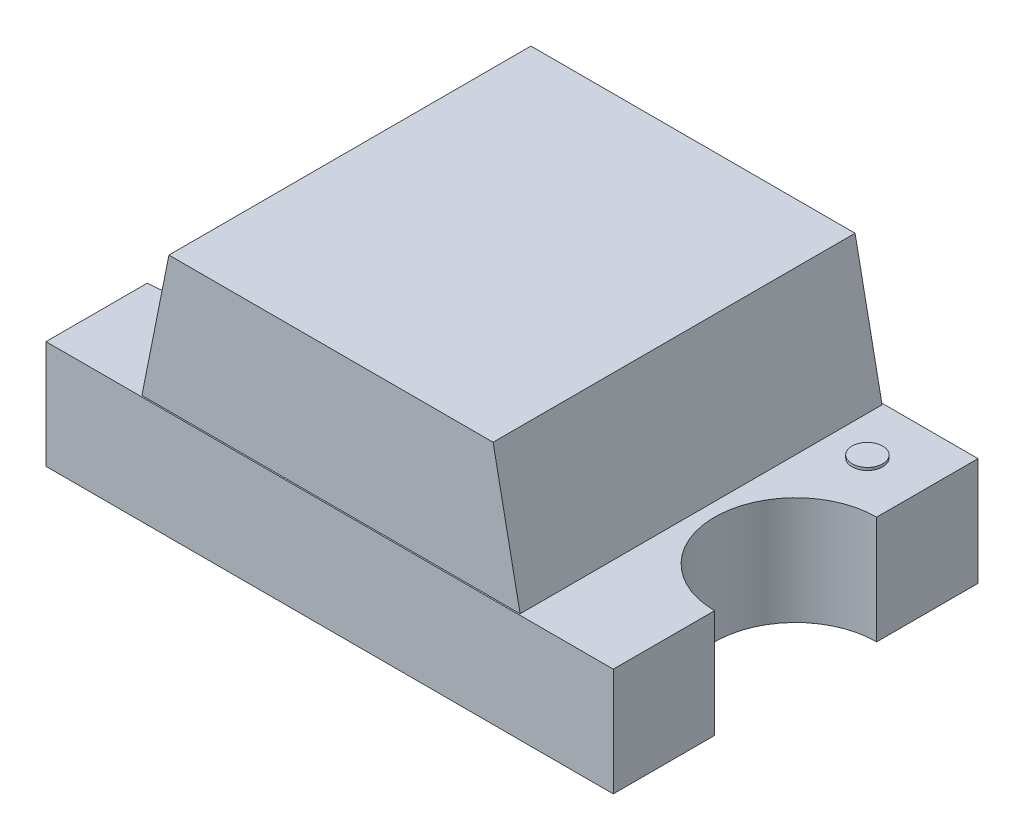
ISO-10303-21;
HEADER;
FILE_DESCRIPTION(('STEP AP214'),'2;1');
FILE_NAME('part.step','',(''),(''),'','','');
FILE_SCHEMA(('AUTOMOTIVE_DESIGN { 1 0 10303 214 1 1 1 1 }'));
ENDSEC;
DATA;
#1=APPLICATION_CONTEXT('core data for automotive mechanical design processes');
#2=APPLICATION_PROTOCOL_DEFINITION('international standard','automotive_design',2000,#1);
#3=PRODUCT_CONTEXT('',#1,'mechanical');
#4=PRODUCT('Part','Part','',(#3));
#5=PRODUCT_RELATED_PRODUCT_CATEGORY('part','',(#4));
#6=PRODUCT_DEFINITION_FORMATION('','',#4);
#7=PRODUCT_DEFINITION_CONTEXT('part definition',#1,'design');
#8=PRODUCT_DEFINITION('design','',#6,#7);
#9=PRODUCT_DEFINITION_SHAPE('','',#8);
#10=(LENGTH_UNIT() NAMED_UNIT(*) SI_UNIT(.MILLI.,.METRE.));
#11=(NAMED_UNIT(*) PLANE_ANGLE_UNIT() SI_UNIT($,.RADIAN.));
#12=(NAMED_UNIT(*) SI_UNIT($,.STERADIAN.) SOLID_ANGLE_UNIT());
#13=UNCERTAINTY_MEASURE_WITH_UNIT(LENGTH_MEASURE(1.E-05),#10,'distance_accuracy_value','');
#14=(GEOMETRIC_REPRESENTATION_CONTEXT(3) GLOBAL_UNCERTAINTY_ASSIGNED_CONTEXT((#13)) GLOBAL_UNIT_ASSIGNED_CONTEXT((#10,
#11,#12)) REPRESENTATION_CONTEXT('',''));
#15=CARTESIAN_POINT('',(0.,0.,0.));
#16=DIRECTION('',(0.,0.,1.));
#17=DIRECTION('',(1.,0.,0.));
#18=AXIS2_PLACEMENT_3D('',#15,#16,#17);
#19=CARTESIAN_POINT('',(-0.7,0.9,-0.67));
#20=DIRECTION('',(0.,0.,1.));
#21=DIRECTION('',(1.,0.,0.));
#22=AXIS2_PLACEMENT_3D('',#19,#20,#21);
#23=PLANE('',#22);
#24=DIRECTION('',(-1.,0.,0.));
#25=VECTOR('',#24,1.);
#26=CARTESIAN_POINT('',(-0.7,0.9,-0.67));
#27=LINE('',#26,#25);
#28=CARTESIAN_POINT('',(0.6,0.9,-0.67));
#29=VERTEX_POINT('',#28);
#30=CARTESIAN_POINT('',(-0.6,0.9,-0.67));
#31=VERTEX_POINT('',#30);
#32=EDGE_CURVE('E87',#29,#31,#27,.T.);
#33=ORIENTED_EDGE('',*,*,#32,.F.);
#34=DIRECTION('',(-0.196116135138181,0.980580675690921,0.));
#35=VECTOR('',#34,1.);
#36=CARTESIAN_POINT('',(0.6,0.9,-0.67));
#37=LINE('',#36,#35);
#38=CARTESIAN_POINT('',(0.7,0.4,-0.67));
#39=VERTEX_POINT('',#38);
#40=EDGE_CURVE('E82',#29,#39,#37,.F.);
#41=ORIENTED_EDGE('',*,*,#40,.T.);
#42=DIRECTION('',(-1.,0.,0.));
#43=VECTOR('',#42,1.);
#44=CARTESIAN_POINT('',(-0.7,0.4,-0.67));
#45=LINE('',#44,#43);
#46=CARTESIAN_POINT('',(-0.7,0.4,-0.67));
#47=VERTEX_POINT('',#46);
#48=EDGE_CURVE('E84',#39,#47,#45,.T.);
#49=ORIENTED_EDGE('',*,*,#48,.T.);
#50=DIRECTION('',(-0.196116135138181,-0.980580675690921,0.));
#51=VECTOR('',#50,1.);
#52=CARTESIAN_POINT('',(-0.6,0.9,-0.67));
#53=LINE('',#52,#51);
#54=EDGE_CURVE('E92',#47,#31,#53,.F.);
#55=ORIENTED_EDGE('',*,*,#54,.T.);
#56=EDGE_LOOP('',(#33,#41,#49,#55));
#57=FACE_BOUND('',#56,.T.);
#58=ADVANCED_FACE('F43',(#57),#23,.F.);
#59=CARTESIAN_POINT('',(-0.7,0.9,0.67));
#60=DIRECTION('',(0.,0.,-1.));
#61=DIRECTION('',(-1.,0.,0.));
#62=AXIS2_PLACEMENT_3D('',#59,#60,#61);
#63=PLANE('',#62);
#64=DIRECTION('',(1.,0.,0.));
#65=VECTOR('',#64,1.);
#66=CARTESIAN_POINT('',(-0.7,0.4,0.67));
#67=LINE('',#66,#65);
#68=CARTESIAN_POINT('',(-0.7,0.4,0.67));
#69=VERTEX_POINT('',#68);
#70=CARTESIAN_POINT('',(0.7,0.4,0.67));
#71=VERTEX_POINT('',#70);
#72=EDGE_CURVE('E109',#69,#71,#67,.T.);
#73=ORIENTED_EDGE('',*,*,#72,.T.);
#74=DIRECTION('',(0.196116135138181,-0.980580675690921,0.));
#75=VECTOR('',#74,1.);
#76=CARTESIAN_POINT('',(0.6,0.9,0.67));
#77=LINE('',#76,#75);
#78=CARTESIAN_POINT('',(0.6,0.9,0.67));
#79=VERTEX_POINT('',#78);
#80=EDGE_CURVE('E12',#71,#79,#77,.F.);
#81=ORIENTED_EDGE('',*,*,#80,.T.);
#82=DIRECTION('',(1.,0.,0.));
#83=VECTOR('',#82,1.);
#84=CARTESIAN_POINT('',(-0.7,0.9,0.67));
#85=LINE('',#84,#83);
#86=CARTESIAN_POINT('',(-0.6,0.9,0.67));
#87=VERTEX_POINT('',#86);
#88=EDGE_CURVE('E105',#87,#79,#85,.T.);
#89=ORIENTED_EDGE('',*,*,#88,.F.);
#90=DIRECTION('',(0.196116135138181,0.980580675690921,0.));
#91=VECTOR('',#90,1.);
#92=CARTESIAN_POINT('',(-0.6,0.9,0.67));
#93=LINE('',#92,#91);
#94=EDGE_CURVE('E51',#87,#69,#93,.F.);
#95=ORIENTED_EDGE('',*,*,#94,.T.);
#96=EDGE_LOOP('',(#73,#81,#89,#95));
#97=FACE_BOUND('',#96,.T.);
#98=ADVANCED_FACE('F115',(#97),#63,.F.);
#99=CARTESIAN_POINT('',(0.,0.9,0.));
#100=DIRECTION('',(0.,-1.,0.));
#101=DIRECTION('',(0.,0.,-1.));
#102=AXIS2_PLACEMENT_3D('',#99,#100,#101);
#103=PLANE('',#102);
#104=ORIENTED_EDGE('',*,*,#88,.T.);
#105=DIRECTION('',(0.,0.,-1.));
#106=VECTOR('',#105,1.);
#107=CARTESIAN_POINT('',(0.6,0.9,0.));
#108=LINE('',#107,#106);
#109=EDGE_CURVE('E113',#79,#29,#108,.T.);
#110=ORIENTED_EDGE('',*,*,#109,.T.);
#111=ORIENTED_EDGE('',*,*,#32,.T.);
#112=DIRECTION('',(0.,0.,1.));
#113=VECTOR('',#112,1.);
#114=CARTESIAN_POINT('',(-0.6,0.9,0.));
#115=LINE('',#114,#113);
#116=EDGE_CURVE('E111',#31,#87,#115,.T.);
#117=ORIENTED_EDGE('',*,*,#116,.T.);
#118=EDGE_LOOP('',(#104,#110,#111,#117));
#119=FACE_BOUND('',#118,.T.);
#120=ADVANCED_FACE('F117',(#119),#103,.F.);
#121=CARTESIAN_POINT('',(0.,0.4,0.));
#122=DIRECTION('',(0.,-1.,0.));
#123=DIRECTION('',(0.,0.,-1.));
#124=AXIS2_PLACEMENT_3D('',#121,#122,#123);
#125=PLANE('',#124);
#126=DIRECTION('',(0.,0.,-1.));
#127=VECTOR('',#126,1.);
#128=CARTESIAN_POINT('',(0.7,0.4,0.67));
#129=LINE('',#128,#127);
#130=EDGE_CURVE('E98',#71,#39,#129,.T.);
#131=ORIENTED_EDGE('',*,*,#130,.F.);
#132=ORIENTED_EDGE('',*,*,#72,.F.);
#133=DIRECTION('',(0.,0.,1.));
#134=VECTOR('',#133,1.);
#135=CARTESIAN_POINT('',(-0.7,0.4,0.67));
#136=LINE('',#135,#134);
#137=EDGE_CURVE('E99',#47,#69,#136,.T.);
#138=ORIENTED_EDGE('',*,*,#137,.F.);
#139=ORIENTED_EDGE('',*,*,#48,.F.);
#140=EDGE_LOOP('',(#131,#132,#138,#139));
#141=FACE_BOUND('',#140,.T.);
#142=ADVANCED_FACE('F96',(#141),#125,.T.);
#143=CARTESIAN_POINT('',(0.6,0.9,0.));
#144=DIRECTION('',(-0.980580675690921,-0.196116135138181,0.));
#145=DIRECTION('',(0.,0.,-1.));
#146=AXIS2_PLACEMENT_3D('',#143,#144,#145);
#147=PLANE('',#146);
#148=ORIENTED_EDGE('',*,*,#80,.F.);
#149=ORIENTED_EDGE('',*,*,#130,.T.);
#150=ORIENTED_EDGE('',*,*,#40,.F.);
#151=ORIENTED_EDGE('',*,*,#109,.F.);
#152=EDGE_LOOP('',(#148,#149,#150,#151));
#153=FACE_BOUND('',#152,.T.);
#154=ADVANCED_FACE('F102',(#153),#147,.F.);
#155=CARTESIAN_POINT('',(-0.6,0.9,0.));
#156=DIRECTION('',(0.980580675690921,-0.196116135138181,0.));
#157=DIRECTION('',(0.,0.,1.));
#158=AXIS2_PLACEMENT_3D('',#155,#156,#157);
#159=PLANE('',#158);
#160=ORIENTED_EDGE('',*,*,#54,.F.);
#161=ORIENTED_EDGE('',*,*,#137,.T.);
#162=ORIENTED_EDGE('',*,*,#94,.F.);
#163=ORIENTED_EDGE('',*,*,#116,.F.);
#164=EDGE_LOOP('',(#160,#161,#162,#163));
#165=FACE_BOUND('',#164,.T.);
#166=ADVANCED_FACE('F45',(#165),#159,.F.);
#167=CLOSED_SHELL('',(#58,#98,#120,#142,#154,#166));
#168=MANIFOLD_SOLID_BREP('B2',#167);
#169=CARTESIAN_POINT('',(-1.05,0.4,0.));
#170=DIRECTION('',(0.,-1.,0.));
#171=DIRECTION('',(0.,0.,-1.));
#172=AXIS2_PLACEMENT_3D('',#169,#170,#171);
#173=PLANE('',#172);
#174=DIRECTION('',(0.,0.,-1.));
#175=VECTOR('',#174,1.);
#176=CARTESIAN_POINT('',(1.05,0.4,-0.3));
#177=LINE('',#176,#175);
#178=CARTESIAN_POINT('',(1.05,0.4,-0.3));
#179=VERTEX_POINT('',#178);
#180=CARTESIAN_POINT('',(1.05,0.4,-0.675));
#181=VERTEX_POINT('',#180);
#182=EDGE_CURVE('E280',#179,#181,#177,.T.);
#183=ORIENTED_EDGE('',*,*,#182,.T.);
#184=DIRECTION('',(-1.,0.,0.));
#185=VECTOR('',#184,1.);
#186=CARTESIAN_POINT('',(-1.05,0.4,-0.675));
#187=LINE('',#186,#185);
#188=CARTESIAN_POINT('',(-1.05,0.4,-0.675));
#189=VERTEX_POINT('',#188);
#190=EDGE_CURVE('E228',#181,#189,#187,.T.);
#191=ORIENTED_EDGE('',*,*,#190,.T.);
#192=DIRECTION('',(0.,0.,1.));
#193=VECTOR('',#192,1.);
#194=CARTESIAN_POINT('',(-1.05,0.4,-0.3));
#195=LINE('',#194,#193);
#196=CARTESIAN_POINT('',(-1.05,0.4,-0.3));
#197=VERTEX_POINT('',#196);
#198=EDGE_CURVE('E311',#189,#197,#195,.T.);
#199=ORIENTED_EDGE('',*,*,#198,.T.);
#200=CARTESIAN_POINT('',(-1.05,0.4,0.));
#201=DIRECTION('',(0.,-1.,0.));
#202=DIRECTION('',(0.,0.,-1.));
#203=AXIS2_PLACEMENT_3D('',#200,#201,#202);
#204=CIRCLE('',#203,0.3);
#205=CARTESIAN_POINT('',(-1.05,0.4,0.3));
#206=VERTEX_POINT('',#205);
#207=EDGE_CURVE('E310',#197,#206,#204,.T.);
#208=ORIENTED_EDGE('',*,*,#207,.T.);
#209=DIRECTION('',(0.,0.,1.));
#210=VECTOR('',#209,1.);
#211=CARTESIAN_POINT('',(-1.05,0.4,0.675));
#212=LINE('',#211,#210);
#213=CARTESIAN_POINT('',(-1.05,0.4,0.675));
#214=VERTEX_POINT('',#213);
#215=EDGE_CURVE('E247',#206,#214,#212,.T.);
#216=ORIENTED_EDGE('',*,*,#215,.T.);
#217=DIRECTION('',(1.,0.,0.));
#218=VECTOR('',#217,1.);
#219=CARTESIAN_POINT('',(-1.05,0.4,0.675));
#220=LINE('',#219,#218);
#221=CARTESIAN_POINT('',(1.05,0.4,0.675));
#222=VERTEX_POINT('',#221);
#223=EDGE_CURVE('E241',#214,#222,#220,.T.);
#224=ORIENTED_EDGE('',*,*,#223,.T.);
#225=DIRECTION('',(0.,0.,-1.));
#226=VECTOR('',#225,1.);
#227=CARTESIAN_POINT('',(1.05,0.4,0.675));
#228=LINE('',#227,#226);
#229=CARTESIAN_POINT('',(1.05,0.4,0.3));
#230=VERTEX_POINT('',#229);
#231=EDGE_CURVE('E245',#222,#230,#228,.T.);
#232=ORIENTED_EDGE('',*,*,#231,.T.);
#233=CARTESIAN_POINT('',(1.05,0.4,0.));
#234=DIRECTION('',(0.,-1.,0.));
#235=DIRECTION('',(0.,0.,1.));
#236=AXIS2_PLACEMENT_3D('',#233,#234,#235);
#237=CIRCLE('',#236,0.3);
#238=EDGE_CURVE('E184',#230,#179,#237,.T.);
#239=ORIENTED_EDGE('',*,*,#238,.T.);
#240=EDGE_LOOP('',(#183,#191,#199,#208,#216,#224,#232,#239));
#241=FACE_BOUND('',#240,.T.);
#242=CARTESIAN_POINT('',(0.843395818690533,0.4,-0.472175464578615));
#243=DIRECTION('',(0.,-1.,0.));
#244=DIRECTION('',(0.,0.,-1.));
#245=AXIS2_PLACEMENT_3D('',#242,#243,#244);
#246=CIRCLE('',#245,0.0567872496375173);
#247=CARTESIAN_POINT('',(0.843395818690533,0.4,-0.528962714216132));
#248=VERTEX_POINT('',#247);
#249=EDGE_CURVE('E41',#248,#248,#246,.F.);
#250=ORIENTED_EDGE('',*,*,#249,.F.);
#251=EDGE_LOOP('',(#250));
#252=FACE_BOUND('',#251,.T.);
#253=ADVANCED_FACE('F167',(#241,#252),#173,.F.);
#254=CARTESIAN_POINT('',(1.05,0.4,-0.3));
#255=DIRECTION('',(-1.,0.,0.));
#256=DIRECTION('',(0.,0.,1.));
#257=AXIS2_PLACEMENT_3D('',#254,#255,#256);
#258=PLANE('',#257);
#259=DIRECTION('',(0.,0.,-1.));
#260=VECTOR('',#259,1.);
#261=CARTESIAN_POINT('',(1.05,0.,-0.3));
#262=LINE('',#261,#260);
#263=CARTESIAN_POINT('',(1.05,0.,-0.3));
#264=VERTEX_POINT('',#263);
#265=CARTESIAN_POINT('',(1.05,0.,-0.675));
#266=VERTEX_POINT('',#265);
#267=EDGE_CURVE('E265',#264,#266,#262,.T.);
#268=ORIENTED_EDGE('',*,*,#267,.T.);
#269=DIRECTION('',(0.,-1.,0.));
#270=VECTOR('',#269,1.);
#271=CARTESIAN_POINT('',(1.05,0.4,-0.675));
#272=LINE('',#271,#270);
#273=EDGE_CURVE('E176',#181,#266,#272,.T.);
#274=ORIENTED_EDGE('',*,*,#273,.F.);
#275=ORIENTED_EDGE('',*,*,#182,.F.);
#276=DIRECTION('',(0.,-1.,0.));
#277=VECTOR('',#276,1.);
#278=CARTESIAN_POINT('',(1.05,0.4,-0.3));
#279=LINE('',#278,#277);
#280=EDGE_CURVE('E261',#179,#264,#279,.T.);
#281=ORIENTED_EDGE('',*,*,#280,.T.);
#282=EDGE_LOOP('',(#268,#274,#275,#281));
#283=FACE_BOUND('',#282,.T.);
#284=ADVANCED_FACE('F169',(#283),#258,.F.);
#285=CARTESIAN_POINT('',(-1.05,0.4,-0.675));
#286=DIRECTION('',(0.,0.,1.));
#287=DIRECTION('',(1.,0.,0.));
#288=AXIS2_PLACEMENT_3D('',#285,#286,#287);
#289=PLANE('',#288);
#290=DIRECTION('',(-1.,0.,0.));
#291=VECTOR('',#290,1.);
#292=CARTESIAN_POINT('',(-1.05,0.,-0.675));
#293=LINE('',#292,#291);
#294=CARTESIAN_POINT('',(-1.05,0.,-0.675));
#295=VERTEX_POINT('',#294);
#296=EDGE_CURVE('E268',#266,#295,#293,.T.);
#297=ORIENTED_EDGE('',*,*,#296,.T.);
#298=DIRECTION('',(0.,-1.,0.));
#299=VECTOR('',#298,1.);
#300=CARTESIAN_POINT('',(-1.05,0.4,-0.675));
#301=LINE('',#300,#299);
#302=EDGE_CURVE('E290',#189,#295,#301,.T.);
#303=ORIENTED_EDGE('',*,*,#302,.F.);
#304=ORIENTED_EDGE('',*,*,#190,.F.);
#305=ORIENTED_EDGE('',*,*,#273,.T.);
#306=EDGE_LOOP('',(#297,#303,#304,#305));
#307=FACE_BOUND('',#306,.T.);
#308=ADVANCED_FACE('F293',(#307),#289,.F.);
#309=CARTESIAN_POINT('',(-1.05,0.4,-0.3));
#310=DIRECTION('',(1.,0.,0.));
#311=DIRECTION('',(0.,0.,-1.));
#312=AXIS2_PLACEMENT_3D('',#309,#310,#311);
#313=PLANE('',#312);
#314=DIRECTION('',(0.,0.,1.));
#315=VECTOR('',#314,1.);
#316=CARTESIAN_POINT('',(-1.05,0.,-0.3));
#317=LINE('',#316,#315);
#318=CARTESIAN_POINT('',(-1.05,0.,-0.3));
#319=VERTEX_POINT('',#318);
#320=EDGE_CURVE('E271',#295,#319,#317,.T.);
#321=ORIENTED_EDGE('',*,*,#320,.T.);
#322=DIRECTION('',(0.,-1.,0.));
#323=VECTOR('',#322,1.);
#324=CARTESIAN_POINT('',(-1.05,0.4,-0.3));
#325=LINE('',#324,#323);
#326=EDGE_CURVE('E287',#197,#319,#325,.T.);
#327=ORIENTED_EDGE('',*,*,#326,.F.);
#328=ORIENTED_EDGE('',*,*,#198,.F.);
#329=ORIENTED_EDGE('',*,*,#302,.T.);
#330=EDGE_LOOP('',(#321,#327,#328,#329));
#331=FACE_BOUND('',#330,.T.);
#332=ADVANCED_FACE('F304',(#331),#313,.F.);
#333=CARTESIAN_POINT('',(-1.05,0.4,0.));
#334=DIRECTION('',(0.,-1.,0.));
#335=DIRECTION('',(0.,0.,-1.));
#336=AXIS2_PLACEMENT_3D('',#333,#334,#335);
#337=CYLINDRICAL_SURFACE('',#336,0.3);
#338=CARTESIAN_POINT('',(-1.05,0.,0.));
#339=DIRECTION('',(0.,-1.,0.));
#340=DIRECTION('',(0.,0.,-1.));
#341=AXIS2_PLACEMENT_3D('',#338,#339,#340);
#342=CIRCLE('',#341,0.3);
#343=CARTESIAN_POINT('',(-1.05,0.,0.3));
#344=VERTEX_POINT('',#343);
#345=EDGE_CURVE('E273',#319,#344,#342,.T.);
#346=ORIENTED_EDGE('',*,*,#345,.T.);
#347=DIRECTION('',(0.,-1.,0.));
#348=VECTOR('',#347,1.);
#349=CARTESIAN_POINT('',(-1.05,0.4,0.3));
#350=LINE('',#349,#348);
#351=EDGE_CURVE('E284',#206,#344,#350,.T.);
#352=ORIENTED_EDGE('',*,*,#351,.F.);
#353=ORIENTED_EDGE('',*,*,#207,.F.);
#354=ORIENTED_EDGE('',*,*,#326,.T.);
#355=EDGE_LOOP('',(#346,#352,#353,#354));
#356=FACE_BOUND('',#355,.T.);
#357=ADVANCED_FACE('F308',(#356),#337,.F.);
#358=CARTESIAN_POINT('',(-1.05,0.4,0.675));
#359=DIRECTION('',(1.,0.,0.));
#360=DIRECTION('',(0.,0.,-1.));
#361=AXIS2_PLACEMENT_3D('',#358,#359,#360);
#362=PLANE('',#361);
#363=DIRECTION('',(0.,0.,1.));
#364=VECTOR('',#363,1.);
#365=CARTESIAN_POINT('',(-1.05,0.,0.675));
#366=LINE('',#365,#364);
#367=CARTESIAN_POINT('',(-1.05,0.,0.675));
#368=VERTEX_POINT('',#367);
#369=EDGE_CURVE('E275',#344,#368,#366,.T.);
#370=ORIENTED_EDGE('',*,*,#369,.T.);
#371=DIRECTION('',(0.,-1.,0.));
#372=VECTOR('',#371,1.);
#373=CARTESIAN_POINT('',(-1.05,0.4,0.675));
#374=LINE('',#373,#372);
#375=EDGE_CURVE('E256',#214,#368,#374,.T.);
#376=ORIENTED_EDGE('',*,*,#375,.F.);
#377=ORIENTED_EDGE('',*,*,#215,.F.);
#378=ORIENTED_EDGE('',*,*,#351,.T.);
#379=EDGE_LOOP('',(#370,#376,#377,#378));
#380=FACE_BOUND('',#379,.T.);
#381=ADVANCED_FACE('F343',(#380),#362,.F.);
#382=CARTESIAN_POINT('',(-1.05,0.4,0.675));
#383=DIRECTION('',(0.,0.,-1.));
#384=DIRECTION('',(-1.,0.,0.));
#385=AXIS2_PLACEMENT_3D('',#382,#383,#384);
#386=PLANE('',#385);
#387=DIRECTION('',(1.,0.,0.));
#388=VECTOR('',#387,1.);
#389=CARTESIAN_POINT('',(-1.05,0.,0.675));
#390=LINE('',#389,#388);
#391=CARTESIAN_POINT('',(1.05,0.,0.675));
#392=VERTEX_POINT('',#391);
#393=EDGE_CURVE('E255',#368,#392,#390,.T.);
#394=ORIENTED_EDGE('',*,*,#393,.T.);
#395=DIRECTION('',(0.,-1.,0.));
#396=VECTOR('',#395,1.);
#397=CARTESIAN_POINT('',(1.05,0.4,0.675));
#398=LINE('',#397,#396);
#399=EDGE_CURVE('E252',#222,#392,#398,.T.);
#400=ORIENTED_EDGE('',*,*,#399,.F.);
#401=ORIENTED_EDGE('',*,*,#223,.F.);
#402=ORIENTED_EDGE('',*,*,#375,.T.);
#403=EDGE_LOOP('',(#394,#400,#401,#402));
#404=FACE_BOUND('',#403,.T.);
#405=ADVANCED_FACE('F253',(#404),#386,.F.);
#406=CARTESIAN_POINT('',(1.05,0.4,0.675));
#407=DIRECTION('',(-1.,0.,0.));
#408=DIRECTION('',(0.,0.,1.));
#409=AXIS2_PLACEMENT_3D('',#406,#407,#408);
#410=PLANE('',#409);
#411=DIRECTION('',(0.,0.,-1.));
#412=VECTOR('',#411,1.);
#413=CARTESIAN_POINT('',(1.05,0.,0.675));
#414=LINE('',#413,#412);
#415=CARTESIAN_POINT('',(1.05,0.,0.3));
#416=VERTEX_POINT('',#415);
#417=EDGE_CURVE('E213',#392,#416,#414,.T.);
#418=ORIENTED_EDGE('',*,*,#417,.T.);
#419=DIRECTION('',(0.,-1.,0.));
#420=VECTOR('',#419,1.);
#421=CARTESIAN_POINT('',(1.05,0.4,0.3));
#422=LINE('',#421,#420);
#423=EDGE_CURVE('E257',#230,#416,#422,.T.);
#424=ORIENTED_EDGE('',*,*,#423,.F.);
#425=ORIENTED_EDGE('',*,*,#231,.F.);
#426=ORIENTED_EDGE('',*,*,#399,.T.);
#427=EDGE_LOOP('',(#418,#424,#425,#426));
#428=FACE_BOUND('',#427,.T.);
#429=ADVANCED_FACE('F259',(#428),#410,.F.);
#430=CARTESIAN_POINT('',(1.05,0.4,0.));
#431=DIRECTION('',(0.,-1.,0.));
#432=DIRECTION('',(0.,0.,-1.));
#433=AXIS2_PLACEMENT_3D('',#430,#431,#432);
#434=CYLINDRICAL_SURFACE('',#433,0.3);
#435=CARTESIAN_POINT('',(1.05,0.,0.));
#436=DIRECTION('',(0.,-1.,0.));
#437=DIRECTION('',(0.,0.,1.));
#438=AXIS2_PLACEMENT_3D('',#435,#436,#437);
#439=CIRCLE('',#438,0.3);
#440=EDGE_CURVE('E219',#416,#264,#439,.T.);
#441=ORIENTED_EDGE('',*,*,#440,.T.);
#442=ORIENTED_EDGE('',*,*,#280,.F.);
#443=ORIENTED_EDGE('',*,*,#238,.F.);
#444=ORIENTED_EDGE('',*,*,#423,.T.);
#445=EDGE_LOOP('',(#441,#442,#443,#444));
#446=FACE_BOUND('',#445,.T.);
#447=ADVANCED_FACE('F336',(#446),#434,.F.);
#448=CARTESIAN_POINT('',(-1.05,0.,0.));
#449=DIRECTION('',(0.,-1.,0.));
#450=DIRECTION('',(0.,0.,-1.));
#451=AXIS2_PLACEMENT_3D('',#448,#449,#450);
#452=PLANE('',#451);
#453=ORIENTED_EDGE('',*,*,#267,.F.);
#454=ORIENTED_EDGE('',*,*,#440,.F.);
#455=ORIENTED_EDGE('',*,*,#417,.F.);
#456=ORIENTED_EDGE('',*,*,#393,.F.);
#457=ORIENTED_EDGE('',*,*,#369,.F.);
#458=ORIENTED_EDGE('',*,*,#345,.F.);
#459=ORIENTED_EDGE('',*,*,#320,.F.);
#460=ORIENTED_EDGE('',*,*,#296,.F.);
#461=EDGE_LOOP('',(#453,#454,#455,#456,#457,#458,#459,#460));
#462=FACE_BOUND('',#461,.T.);
#463=ADVANCED_FACE('F298',(#462),#452,.T.);
#464=CARTESIAN_POINT('',(0.843395818690533,0.41,-0.472175464578615));
#465=DIRECTION('',(0.,-1.,0.));
#466=DIRECTION('',(0.,0.,-1.));
#467=AXIS2_PLACEMENT_3D('',#464,#465,#466);
#468=CYLINDRICAL_SURFACE('',#467,0.0567872496375173);
#469=CARTESIAN_POINT('',(0.843395818690533,0.41,-0.472175464578615));
#470=DIRECTION('',(0.,1.,0.));
#471=DIRECTION('',(0.,0.,1.));
#472=AXIS2_PLACEMENT_3D('',#469,#470,#471);
#473=CIRCLE('',#472,0.0567872496375173);
#474=CARTESIAN_POINT('',(0.843395818690533,0.41,-0.415388214941098));
#475=VERTEX_POINT('',#474);
#476=EDGE_CURVE('E269',#475,#475,#473,.T.);
#477=ORIENTED_EDGE('',*,*,#476,.F.);
#478=EDGE_LOOP('',(#477));
#479=FACE_BOUND('',#478,.T.);
#480=ORIENTED_EDGE('',*,*,#249,.T.);
#481=EDGE_LOOP('',(#480));
#482=FACE_BOUND('',#481,.T.);
#483=ADVANCED_FACE('F322',(#479,#482),#468,.T.);
#484=CARTESIAN_POINT('',(0.843395818690533,0.41,-0.472175464578615));
#485=DIRECTION('',(0.,1.,0.));
#486=DIRECTION('',(0.,0.,1.));
#487=AXIS2_PLACEMENT_3D('',#484,#485,#486);
#488=PLANE('',#487);
#489=ORIENTED_EDGE('',*,*,#476,.T.);
#490=EDGE_LOOP('',(#489));
#491=FACE_BOUND('',#490,.T.);
#492=ADVANCED_FACE('F320',(#491),#488,.T.);
#493=CLOSED_SHELL('',(#253,#284,#308,#332,#357,#381,#405,#429,#447,#463,#483,#492));
#494=MANIFOLD_SOLID_BREP('B6',#493);
#495=ADVANCED_BREP_SHAPE_REPRESENTATION('',(#18,#168,#494),#14);
#496=SHAPE_DEFINITION_REPRESENTATION(#9,#495);
ENDSEC;
END-ISO-10303-21;
